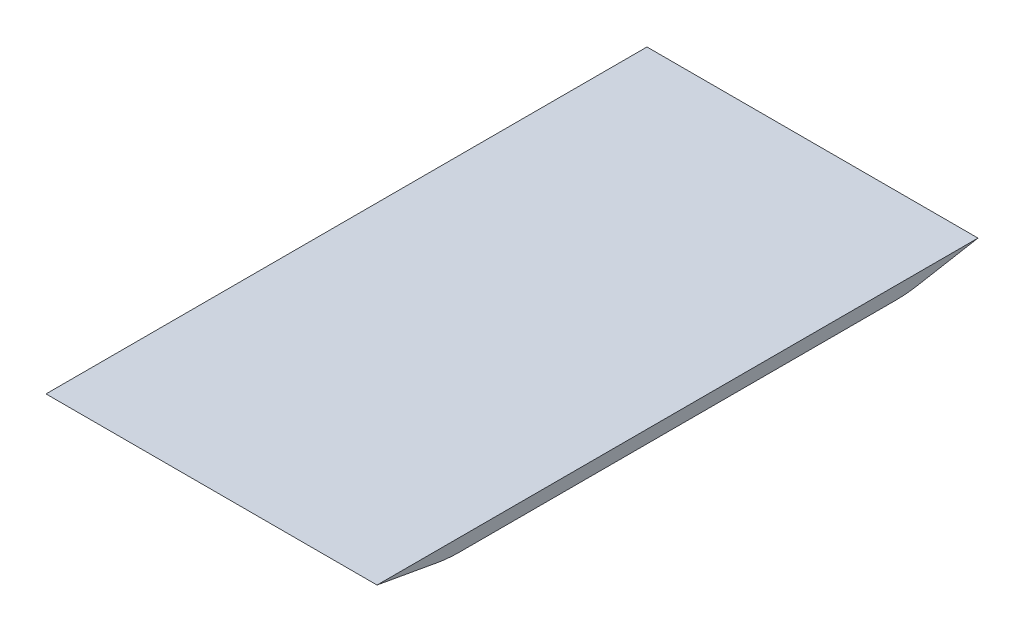
ISO-10303-21;
HEADER;
FILE_DESCRIPTION(('STEP AP214'),'2;1');
FILE_NAME('part.step','',(''),(''),'','','');
FILE_SCHEMA(('AUTOMOTIVE_DESIGN { 1 0 10303 214 1 1 1 1 }'));
ENDSEC;
DATA;
#1=APPLICATION_CONTEXT('core data for automotive mechanical design processes');
#2=APPLICATION_PROTOCOL_DEFINITION('international standard','automotive_design',2000,#1);
#3=PRODUCT_CONTEXT('',#1,'mechanical');
#4=PRODUCT('Part','Part','',(#3));
#5=PRODUCT_RELATED_PRODUCT_CATEGORY('part','',(#4));
#6=PRODUCT_DEFINITION_FORMATION('','',#4);
#7=PRODUCT_DEFINITION_CONTEXT('part definition',#1,'design');
#8=PRODUCT_DEFINITION('design','',#6,#7);
#9=PRODUCT_DEFINITION_SHAPE('','',#8);
#10=(LENGTH_UNIT() NAMED_UNIT(*) SI_UNIT(.MILLI.,.METRE.));
#11=(NAMED_UNIT(*) PLANE_ANGLE_UNIT() SI_UNIT($,.RADIAN.));
#12=(NAMED_UNIT(*) SI_UNIT($,.STERADIAN.) SOLID_ANGLE_UNIT());
#13=UNCERTAINTY_MEASURE_WITH_UNIT(LENGTH_MEASURE(1.E-05),#10,'distance_accuracy_value','');
#14=(GEOMETRIC_REPRESENTATION_CONTEXT(3) GLOBAL_UNCERTAINTY_ASSIGNED_CONTEXT((#13)) GLOBAL_UNIT_ASSIGNED_CONTEXT((#10,
#11,#12)) REPRESENTATION_CONTEXT('',''));
#15=CARTESIAN_POINT('',(0.,0.,0.));
#16=DIRECTION('',(0.,0.,1.));
#17=DIRECTION('',(1.,0.,0.));
#18=AXIS2_PLACEMENT_3D('',#15,#16,#17);
#19=CARTESIAN_POINT('',(130.,-5.00000000000001,-28.));
#20=DIRECTION('',(0.,0.984427575508482,-0.175790638483658));
#21=DIRECTION('',(0.,0.175790638483658,0.984427575508482));
#22=AXIS2_PLACEMENT_3D('',#19,#20,#21);
#23=PLANE('',#22);
#24=DIRECTION('',(0.,-0.175790638483658,-0.984427575508482));
#25=VECTOR('',#24,1.);
#26=CARTESIAN_POINT('',(0.,-5.00000000000001,-28.));
#27=LINE('',#26,#25);
#28=CARTESIAN_POINT('',(0.,0.,0.));
#29=VERTEX_POINT('',#28);
#30=CARTESIAN_POINT('',(0.,-4.22137877542411,-23.6397211423749));
#31=VERTEX_POINT('',#30);
#32=EDGE_CURVE('E114',#29,#31,#27,.T.);
#33=ORIENTED_EDGE('',*,*,#32,.T.);
#34=DIRECTION('',(-1.,0.,0.));
#35=VECTOR('',#34,1.);
#36=CARTESIAN_POINT('',(130.,-4.22137877542411,-23.6397211423749));
#37=LINE('',#36,#35);
#38=CARTESIAN_POINT('',(130.,-4.22137877542411,-23.6397211423749));
#39=VERTEX_POINT('',#38);
#40=EDGE_CURVE('E58',#31,#39,#37,.F.);
#41=ORIENTED_EDGE('',*,*,#40,.T.);
#42=DIRECTION('',(0.,-0.175790638483658,-0.984427575508482));
#43=VECTOR('',#42,1.);
#44=CARTESIAN_POINT('',(130.,-5.00000000000001,-28.));
#45=LINE('',#44,#43);
#46=CARTESIAN_POINT('',(130.,0.,0.));
#47=VERTEX_POINT('',#46);
#48=EDGE_CURVE('E121',#47,#39,#45,.T.);
#49=ORIENTED_EDGE('',*,*,#48,.F.);
#50=DIRECTION('',(-1.,0.,0.));
#51=VECTOR('',#50,1.);
#52=CARTESIAN_POINT('',(130.,0.,0.));
#53=LINE('',#52,#51);
#54=EDGE_CURVE('E106',#47,#29,#53,.T.);
#55=ORIENTED_EDGE('',*,*,#54,.T.);
#56=EDGE_LOOP('',(#33,#41,#49,#55));
#57=FACE_BOUND('',#56,.T.);
#58=ADVANCED_FACE('F35',(#57),#23,.F.);
#59=CARTESIAN_POINT('',(130.,-4.99999999999998,-208.));
#60=DIRECTION('',(0.,1.,0.));
#61=DIRECTION('',(0.,0.,1.));
#62=AXIS2_PLACEMENT_3D('',#59,#60,#61);
#63=PLANE('',#62);
#64=DIRECTION('',(0.,0.,-1.));
#65=VECTOR('',#64,1.);
#66=CARTESIAN_POINT('',(130.,-4.99999999999998,-208.));
#67=LINE('',#66,#65);
#68=CARTESIAN_POINT('',(130.,-5.00000000000001,-32.4292530665579));
#69=VERTEX_POINT('',#68);
#70=CARTESIAN_POINT('',(130.,-4.99999999999998,-203.570746933442));
#71=VERTEX_POINT('',#70);
#72=EDGE_CURVE('E96',#69,#71,#67,.T.);
#73=ORIENTED_EDGE('',*,*,#72,.F.);
#74=DIRECTION('',(-1.,0.,0.));
#75=VECTOR('',#74,1.);
#76=CARTESIAN_POINT('',(130.,-5.00000000000001,-32.4292530665578));
#77=LINE('',#76,#75);
#78=CARTESIAN_POINT('',(0.,-5.00000000000001,-32.4292530665579));
#79=VERTEX_POINT('',#78);
#80=EDGE_CURVE('E124',#69,#79,#77,.T.);
#81=ORIENTED_EDGE('',*,*,#80,.T.);
#82=DIRECTION('',(0.,0.,-1.));
#83=VECTOR('',#82,1.);
#84=CARTESIAN_POINT('',(0.,-4.99999999999998,-208.));
#85=LINE('',#84,#83);
#86=CARTESIAN_POINT('',(0.,-4.99999999999998,-203.570746933442));
#87=VERTEX_POINT('',#86);
#88=EDGE_CURVE('E116',#79,#87,#85,.T.);
#89=ORIENTED_EDGE('',*,*,#88,.T.);
#90=DIRECTION('',(-1.,0.,0.));
#91=VECTOR('',#90,1.);
#92=CARTESIAN_POINT('',(130.,-4.99999999999998,-203.570746933442));
#93=LINE('',#92,#91);
#94=EDGE_CURVE('E105',#87,#71,#93,.F.);
#95=ORIENTED_EDGE('',*,*,#94,.T.);
#96=EDGE_LOOP('',(#73,#81,#89,#95));
#97=FACE_BOUND('',#96,.T.);
#98=ADVANCED_FACE('F137',(#97),#63,.F.);
#99=CARTESIAN_POINT('',(130.,0.,-236.));
#100=DIRECTION('',(0.,0.984427575508482,0.175790638483659));
#101=DIRECTION('',(0.,-0.175790638483659,0.984427575508482));
#102=AXIS2_PLACEMENT_3D('',#99,#100,#101);
#103=PLANE('',#102);
#104=DIRECTION('',(0.,0.175790638483659,-0.984427575508482));
#105=VECTOR('',#104,1.);
#106=CARTESIAN_POINT('',(130.,0.,-236.));
#107=LINE('',#106,#105);
#108=CARTESIAN_POINT('',(130.,-4.22137877542406,-212.360278857625));
#109=VERTEX_POINT('',#108);
#110=CARTESIAN_POINT('',(130.,0.,-236.));
#111=VERTEX_POINT('',#110);
#112=EDGE_CURVE('E88',#109,#111,#107,.T.);
#113=ORIENTED_EDGE('',*,*,#112,.F.);
#114=DIRECTION('',(-1.,0.,0.));
#115=VECTOR('',#114,1.);
#116=CARTESIAN_POINT('',(130.,-4.22137877542407,-212.360278857625));
#117=LINE('',#116,#115);
#118=CARTESIAN_POINT('',(0.,-4.22137877542406,-212.360278857625));
#119=VERTEX_POINT('',#118);
#120=EDGE_CURVE('E11',#109,#119,#117,.T.);
#121=ORIENTED_EDGE('',*,*,#120,.T.);
#122=DIRECTION('',(0.,0.175790638483659,-0.984427575508482));
#123=VECTOR('',#122,1.);
#124=CARTESIAN_POINT('',(0.,0.,-236.));
#125=LINE('',#124,#123);
#126=CARTESIAN_POINT('',(0.,0.,-236.));
#127=VERTEX_POINT('',#126);
#128=EDGE_CURVE('E102',#119,#127,#125,.T.);
#129=ORIENTED_EDGE('',*,*,#128,.T.);
#130=DIRECTION('',(-1.,0.,0.));
#131=VECTOR('',#130,1.);
#132=CARTESIAN_POINT('',(130.,0.,-236.));
#133=LINE('',#132,#131);
#134=EDGE_CURVE('E99',#111,#127,#133,.T.);
#135=ORIENTED_EDGE('',*,*,#134,.F.);
#136=EDGE_LOOP('',(#113,#121,#129,#135));
#137=FACE_BOUND('',#136,.T.);
#138=ADVANCED_FACE('F100',(#137),#103,.F.);
#139=CARTESIAN_POINT('',(130.,0.,0.));
#140=DIRECTION('',(0.,-1.,0.));
#141=DIRECTION('',(0.,0.,-1.));
#142=AXIS2_PLACEMENT_3D('',#139,#140,#141);
#143=PLANE('',#142);
#144=DIRECTION('',(0.,0.,1.));
#145=VECTOR('',#144,1.);
#146=CARTESIAN_POINT('',(0.,0.,0.));
#147=LINE('',#146,#145);
#148=EDGE_CURVE('E120',#127,#29,#147,.T.);
#149=ORIENTED_EDGE('',*,*,#148,.T.);
#150=ORIENTED_EDGE('',*,*,#54,.F.);
#151=DIRECTION('',(0.,0.,1.));
#152=VECTOR('',#151,1.);
#153=CARTESIAN_POINT('',(130.,0.,0.));
#154=LINE('',#153,#152);
#155=EDGE_CURVE('E92',#111,#47,#154,.T.);
#156=ORIENTED_EDGE('',*,*,#155,.F.);
#157=ORIENTED_EDGE('',*,*,#134,.T.);
#158=EDGE_LOOP('',(#149,#150,#156,#157));
#159=FACE_BOUND('',#158,.T.);
#160=ADVANCED_FACE('F108',(#159),#143,.F.);
#161=CARTESIAN_POINT('',(130.,0.,0.));
#162=DIRECTION('',(1.,0.,0.));
#163=DIRECTION('',(0.,0.,-1.));
#164=AXIS2_PLACEMENT_3D('',#161,#162,#163);
#165=PLANE('',#164);
#166=ORIENTED_EDGE('',*,*,#48,.T.);
#167=CARTESIAN_POINT('',(130.,45.,-32.4292530665578));
#168=DIRECTION('',(1.,0.,0.));
#169=DIRECTION('',(0.,0.,-1.));
#170=AXIS2_PLACEMENT_3D('',#167,#168,#169);
#171=CIRCLE('',#170,50.);
#172=EDGE_CURVE('E43',#39,#69,#171,.T.);
#173=ORIENTED_EDGE('',*,*,#172,.T.);
#174=ORIENTED_EDGE('',*,*,#72,.T.);
#175=CARTESIAN_POINT('',(130.,45.,-203.570746933442));
#176=DIRECTION('',(1.,0.,0.));
#177=DIRECTION('',(0.,0.,-1.));
#178=AXIS2_PLACEMENT_3D('',#175,#176,#177);
#179=CIRCLE('',#178,50.);
#180=EDGE_CURVE('E50',#71,#109,#179,.T.);
#181=ORIENTED_EDGE('',*,*,#180,.T.);
#182=ORIENTED_EDGE('',*,*,#112,.T.);
#183=ORIENTED_EDGE('',*,*,#155,.T.);
#184=EDGE_LOOP('',(#166,#173,#174,#181,#182,#183));
#185=FACE_BOUND('',#184,.T.);
#186=ADVANCED_FACE('F90',(#185),#165,.T.);
#187=CARTESIAN_POINT('',(0.,0.,0.));
#188=DIRECTION('',(1.,0.,0.));
#189=DIRECTION('',(0.,0.,-1.));
#190=AXIS2_PLACEMENT_3D('',#187,#188,#189);
#191=PLANE('',#190);
#192=ORIENTED_EDGE('',*,*,#88,.F.);
#193=CARTESIAN_POINT('',(0.,45.,-32.4292530665578));
#194=DIRECTION('',(1.,0.,0.));
#195=DIRECTION('',(0.,0.,-1.));
#196=AXIS2_PLACEMENT_3D('',#193,#194,#195);
#197=CIRCLE('',#196,50.);
#198=EDGE_CURVE('E129',#79,#31,#197,.F.);
#199=ORIENTED_EDGE('',*,*,#198,.T.);
#200=ORIENTED_EDGE('',*,*,#32,.F.);
#201=ORIENTED_EDGE('',*,*,#148,.F.);
#202=ORIENTED_EDGE('',*,*,#128,.F.);
#203=CARTESIAN_POINT('',(0.,45.,-203.570746933442));
#204=DIRECTION('',(1.,0.,0.));
#205=DIRECTION('',(0.,0.,-1.));
#206=AXIS2_PLACEMENT_3D('',#203,#204,#205);
#207=CIRCLE('',#206,50.);
#208=EDGE_CURVE('E127',#119,#87,#207,.F.);
#209=ORIENTED_EDGE('',*,*,#208,.T.);
#210=EDGE_LOOP('',(#192,#199,#200,#201,#202,#209));
#211=FACE_BOUND('',#210,.T.);
#212=ADVANCED_FACE('F143',(#211),#191,.F.);
#213=CARTESIAN_POINT('',(130.,45.,-32.4292530665578));
#214=DIRECTION('',(-1.,0.,0.));
#215=DIRECTION('',(0.,0.,1.));
#216=AXIS2_PLACEMENT_3D('',#213,#214,#215);
#217=CYLINDRICAL_SURFACE('',#216,50.);
#218=ORIENTED_EDGE('',*,*,#172,.F.);
#219=ORIENTED_EDGE('',*,*,#40,.F.);
#220=ORIENTED_EDGE('',*,*,#198,.F.);
#221=ORIENTED_EDGE('',*,*,#80,.F.);
#222=EDGE_LOOP('',(#218,#219,#220,#221));
#223=FACE_BOUND('',#222,.T.);
#224=ADVANCED_FACE('F140',(#223),#217,.T.);
#225=CARTESIAN_POINT('',(130.,45.,-203.570746933442));
#226=DIRECTION('',(-1.,0.,0.));
#227=DIRECTION('',(0.,0.,1.));
#228=AXIS2_PLACEMENT_3D('',#225,#226,#227);
#229=CYLINDRICAL_SURFACE('',#228,50.);
#230=ORIENTED_EDGE('',*,*,#180,.F.);
#231=ORIENTED_EDGE('',*,*,#94,.F.);
#232=ORIENTED_EDGE('',*,*,#208,.F.);
#233=ORIENTED_EDGE('',*,*,#120,.F.);
#234=EDGE_LOOP('',(#230,#231,#232,#233));
#235=FACE_BOUND('',#234,.T.);
#236=ADVANCED_FACE('F37',(#235),#229,.T.);
#237=CLOSED_SHELL('',(#58,#98,#138,#160,#186,#212,#224,#236));
#238=MANIFOLD_SOLID_BREP('B2',#237);
#239=ADVANCED_BREP_SHAPE_REPRESENTATION('',(#18,#238),#14);
#240=SHAPE_DEFINITION_REPRESENTATION(#9,#239);
ENDSEC;
END-ISO-10303-21;
